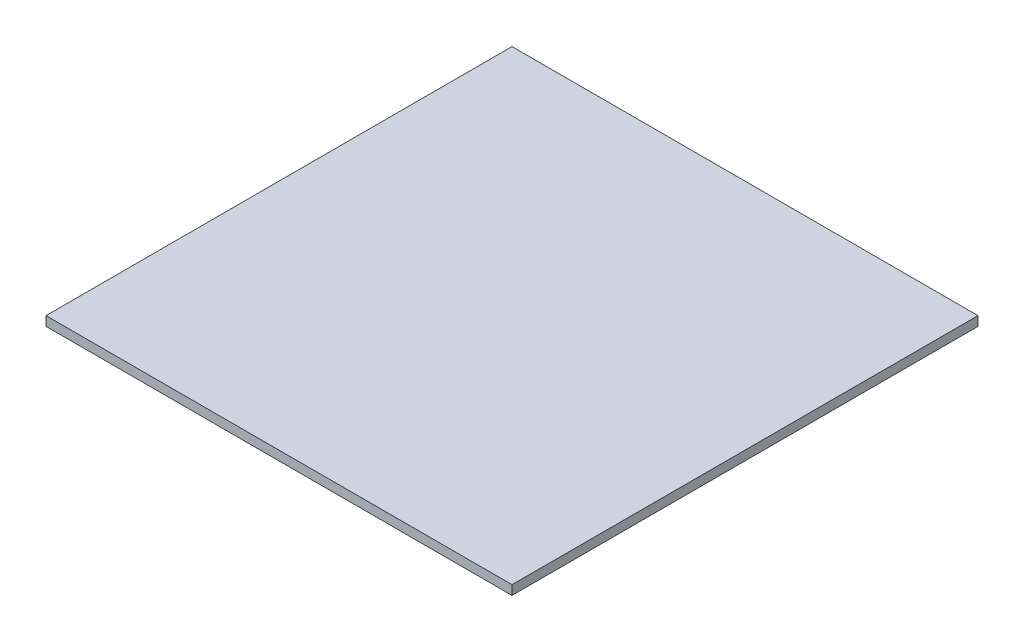
ISO-10303-21;
HEADER;
FILE_DESCRIPTION(('STEP AP214'),'2;1');
FILE_NAME('part.step','',(''),(''),'','','');
FILE_SCHEMA(('AUTOMOTIVE_DESIGN { 1 0 10303 214 1 1 1 1 }'));
ENDSEC;
DATA;
#1=APPLICATION_CONTEXT('core data for automotive mechanical design processes');
#2=APPLICATION_PROTOCOL_DEFINITION('international standard','automotive_design',2000,#1);
#3=PRODUCT_CONTEXT('',#1,'mechanical');
#4=PRODUCT('Part','Part','',(#3));
#5=PRODUCT_RELATED_PRODUCT_CATEGORY('part','',(#4));
#6=PRODUCT_DEFINITION_FORMATION('','',#4);
#7=PRODUCT_DEFINITION_CONTEXT('part definition',#1,'design');
#8=PRODUCT_DEFINITION('design','',#6,#7);
#9=PRODUCT_DEFINITION_SHAPE('','',#8);
#10=(LENGTH_UNIT() NAMED_UNIT(*) SI_UNIT(.MILLI.,.METRE.));
#11=(NAMED_UNIT(*) PLANE_ANGLE_UNIT() SI_UNIT($,.RADIAN.));
#12=(NAMED_UNIT(*) SI_UNIT($,.STERADIAN.) SOLID_ANGLE_UNIT());
#13=UNCERTAINTY_MEASURE_WITH_UNIT(LENGTH_MEASURE(1.E-05),#10,'distance_accuracy_value','');
#14=(GEOMETRIC_REPRESENTATION_CONTEXT(3) GLOBAL_UNCERTAINTY_ASSIGNED_CONTEXT((#13)) GLOBAL_UNIT_ASSIGNED_CONTEXT((#10,
#11,#12)) REPRESENTATION_CONTEXT('',''));
#15=CARTESIAN_POINT('',(0.,0.,0.));
#16=DIRECTION('',(0.,0.,1.));
#17=DIRECTION('',(1.,0.,0.));
#18=AXIS2_PLACEMENT_3D('',#15,#16,#17);
#19=CARTESIAN_POINT('',(0.,4.,0.));
#20=DIRECTION('',(1.,0.,0.));
#21=DIRECTION('',(0.,0.,-1.));
#22=AXIS2_PLACEMENT_3D('',#19,#20,#21);
#23=PLANE('',#22);
#24=DIRECTION('',(0.,0.,1.));
#25=VECTOR('',#24,1.);
#26=CARTESIAN_POINT('',(0.,0.,0.));
#27=LINE('',#26,#25);
#28=CARTESIAN_POINT('',(0.,0.,0.));
#29=VERTEX_POINT('',#28);
#30=CARTESIAN_POINT('',(0.,0.,200.));
#31=VERTEX_POINT('',#30);
#32=EDGE_CURVE('E107',#29,#31,#27,.T.);
#33=ORIENTED_EDGE('',*,*,#32,.T.);
#34=DIRECTION('',(0.,-1.,0.));
#35=VECTOR('',#34,1.);
#36=CARTESIAN_POINT('',(0.,4.,200.));
#37=LINE('',#36,#35);
#38=CARTESIAN_POINT('',(0.,4.,200.));
#39=VERTEX_POINT('',#38);
#40=EDGE_CURVE('E11',#39,#31,#37,.T.);
#41=ORIENTED_EDGE('',*,*,#40,.F.);
#42=DIRECTION('',(0.,0.,1.));
#43=VECTOR('',#42,1.);
#44=CARTESIAN_POINT('',(0.,4.,0.));
#45=LINE('',#44,#43);
#46=CARTESIAN_POINT('',(0.,4.,0.));
#47=VERTEX_POINT('',#46);
#48=EDGE_CURVE('E91',#47,#39,#45,.T.);
#49=ORIENTED_EDGE('',*,*,#48,.F.);
#50=DIRECTION('',(0.,-1.,0.));
#51=VECTOR('',#50,1.);
#52=CARTESIAN_POINT('',(0.,4.,0.));
#53=LINE('',#52,#51);
#54=EDGE_CURVE('E103',#47,#29,#53,.T.);
#55=ORIENTED_EDGE('',*,*,#54,.T.);
#56=EDGE_LOOP('',(#33,#41,#49,#55));
#57=FACE_BOUND('',#56,.T.);
#58=ADVANCED_FACE('F39',(#57),#23,.F.);
#59=CARTESIAN_POINT('',(0.,4.,200.));
#60=DIRECTION('',(0.,0.,-1.));
#61=DIRECTION('',(-1.,0.,0.));
#62=AXIS2_PLACEMENT_3D('',#59,#60,#61);
#63=PLANE('',#62);
#64=DIRECTION('',(1.,0.,0.));
#65=VECTOR('',#64,1.);
#66=CARTESIAN_POINT('',(0.,0.,200.));
#67=LINE('',#66,#65);
#68=CARTESIAN_POINT('',(200.,0.,200.));
#69=VERTEX_POINT('',#68);
#70=EDGE_CURVE('E96',#31,#69,#67,.T.);
#71=ORIENTED_EDGE('',*,*,#70,.T.);
#72=DIRECTION('',(0.,-1.,0.));
#73=VECTOR('',#72,1.);
#74=CARTESIAN_POINT('',(200.,4.,200.));
#75=LINE('',#74,#73);
#76=CARTESIAN_POINT('',(200.,4.,200.));
#77=VERTEX_POINT('',#76);
#78=EDGE_CURVE('E48',#77,#69,#75,.T.);
#79=ORIENTED_EDGE('',*,*,#78,.F.);
#80=DIRECTION('',(1.,0.,0.));
#81=VECTOR('',#80,1.);
#82=CARTESIAN_POINT('',(0.,4.,200.));
#83=LINE('',#82,#81);
#84=EDGE_CURVE('E86',#39,#77,#83,.T.);
#85=ORIENTED_EDGE('',*,*,#84,.F.);
#86=ORIENTED_EDGE('',*,*,#40,.T.);
#87=EDGE_LOOP('',(#71,#79,#85,#86));
#88=FACE_BOUND('',#87,.T.);
#89=ADVANCED_FACE('F95',(#88),#63,.F.);
#90=CARTESIAN_POINT('',(200.,4.,0.));
#91=DIRECTION('',(-1.,0.,0.));
#92=DIRECTION('',(0.,0.,1.));
#93=AXIS2_PLACEMENT_3D('',#90,#91,#92);
#94=PLANE('',#93);
#95=DIRECTION('',(0.,0.,-1.));
#96=VECTOR('',#95,1.);
#97=CARTESIAN_POINT('',(200.,0.,0.));
#98=LINE('',#97,#96);
#99=CARTESIAN_POINT('',(200.,0.,0.));
#100=VERTEX_POINT('',#99);
#101=EDGE_CURVE('E73',#69,#100,#98,.T.);
#102=ORIENTED_EDGE('',*,*,#101,.T.);
#103=DIRECTION('',(0.,-1.,0.));
#104=VECTOR('',#103,1.);
#105=CARTESIAN_POINT('',(200.,4.,0.));
#106=LINE('',#105,#104);
#107=CARTESIAN_POINT('',(200.,4.,0.));
#108=VERTEX_POINT('',#107);
#109=EDGE_CURVE('E98',#108,#100,#106,.T.);
#110=ORIENTED_EDGE('',*,*,#109,.F.);
#111=DIRECTION('',(0.,0.,-1.));
#112=VECTOR('',#111,1.);
#113=CARTESIAN_POINT('',(200.,4.,0.));
#114=LINE('',#113,#112);
#115=EDGE_CURVE('E89',#77,#108,#114,.T.);
#116=ORIENTED_EDGE('',*,*,#115,.F.);
#117=ORIENTED_EDGE('',*,*,#78,.T.);
#118=EDGE_LOOP('',(#102,#110,#116,#117));
#119=FACE_BOUND('',#118,.T.);
#120=ADVANCED_FACE('F99',(#119),#94,.F.);
#121=CARTESIAN_POINT('',(0.,4.,0.));
#122=DIRECTION('',(0.,0.,1.));
#123=DIRECTION('',(1.,0.,0.));
#124=AXIS2_PLACEMENT_3D('',#121,#122,#123);
#125=PLANE('',#124);
#126=DIRECTION('',(-1.,0.,0.));
#127=VECTOR('',#126,1.);
#128=CARTESIAN_POINT('',(0.,0.,0.));
#129=LINE('',#128,#127);
#130=EDGE_CURVE('E79',#100,#29,#129,.T.);
#131=ORIENTED_EDGE('',*,*,#130,.T.);
#132=ORIENTED_EDGE('',*,*,#54,.F.);
#133=DIRECTION('',(-1.,0.,0.));
#134=VECTOR('',#133,1.);
#135=CARTESIAN_POINT('',(0.,4.,0.));
#136=LINE('',#135,#134);
#137=EDGE_CURVE('E56',#108,#47,#136,.T.);
#138=ORIENTED_EDGE('',*,*,#137,.F.);
#139=ORIENTED_EDGE('',*,*,#109,.T.);
#140=EDGE_LOOP('',(#131,#132,#138,#139));
#141=FACE_BOUND('',#140,.T.);
#142=ADVANCED_FACE('F120',(#141),#125,.F.);
#143=CARTESIAN_POINT('',(0.,4.,0.));
#144=DIRECTION('',(0.,1.,0.));
#145=DIRECTION('',(0.,0.,1.));
#146=AXIS2_PLACEMENT_3D('',#143,#144,#145);
#147=PLANE('',#146);
#148=ORIENTED_EDGE('',*,*,#48,.T.);
#149=ORIENTED_EDGE('',*,*,#84,.T.);
#150=ORIENTED_EDGE('',*,*,#115,.T.);
#151=ORIENTED_EDGE('',*,*,#137,.T.);
#152=EDGE_LOOP('',(#148,#149,#150,#151));
#153=FACE_BOUND('',#152,.T.);
#154=ADVANCED_FACE('F87',(#153),#147,.T.);
#155=CARTESIAN_POINT('',(0.,0.,0.));
#156=DIRECTION('',(0.,1.,0.));
#157=DIRECTION('',(0.,0.,1.));
#158=AXIS2_PLACEMENT_3D('',#155,#156,#157);
#159=PLANE('',#158);
#160=ORIENTED_EDGE('',*,*,#32,.F.);
#161=ORIENTED_EDGE('',*,*,#130,.F.);
#162=ORIENTED_EDGE('',*,*,#101,.F.);
#163=ORIENTED_EDGE('',*,*,#70,.F.);
#164=EDGE_LOOP('',(#160,#161,#162,#163));
#165=FACE_BOUND('',#164,.T.);
#166=ADVANCED_FACE('F123',(#165),#159,.F.);
#167=CLOSED_SHELL('',(#58,#89,#120,#142,#154,#166));
#168=MANIFOLD_SOLID_BREP('B2',#167);
#169=ADVANCED_BREP_SHAPE_REPRESENTATION('',(#18,#168),#14);
#170=SHAPE_DEFINITION_REPRESENTATION(#9,#169);
ENDSEC;
END-ISO-10303-21;
